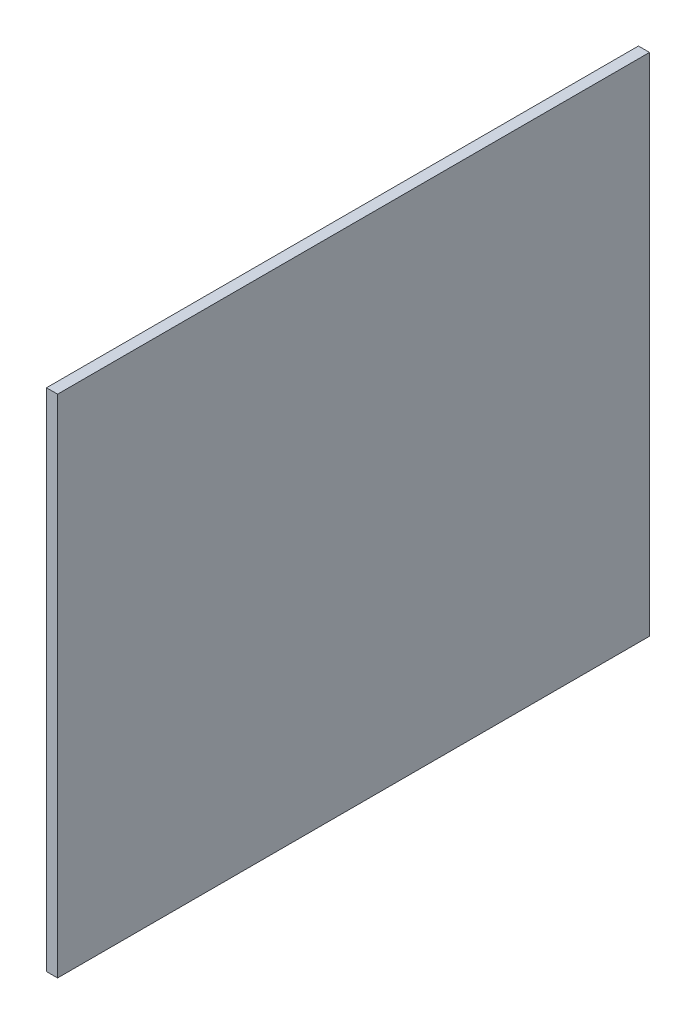
ISO-10303-21;
HEADER;
FILE_DESCRIPTION(('STEP AP214'),'2;1');
FILE_NAME('part.step','',(''),(''),'','','');
FILE_SCHEMA(('AUTOMOTIVE_DESIGN { 1 0 10303 214 1 1 1 1 }'));
ENDSEC;
DATA;
#1=APPLICATION_CONTEXT('core data for automotive mechanical design processes');
#2=APPLICATION_PROTOCOL_DEFINITION('international standard','automotive_design',2000,#1);
#3=PRODUCT_CONTEXT('',#1,'mechanical');
#4=PRODUCT('Part','Part','',(#3));
#5=PRODUCT_RELATED_PRODUCT_CATEGORY('part','',(#4));
#6=PRODUCT_DEFINITION_FORMATION('','',#4);
#7=PRODUCT_DEFINITION_CONTEXT('part definition',#1,'design');
#8=PRODUCT_DEFINITION('design','',#6,#7);
#9=PRODUCT_DEFINITION_SHAPE('','',#8);
#10=(LENGTH_UNIT() NAMED_UNIT(*) SI_UNIT(.MILLI.,.METRE.));
#11=(NAMED_UNIT(*) PLANE_ANGLE_UNIT() SI_UNIT($,.RADIAN.));
#12=(NAMED_UNIT(*) SI_UNIT($,.STERADIAN.) SOLID_ANGLE_UNIT());
#13=UNCERTAINTY_MEASURE_WITH_UNIT(LENGTH_MEASURE(1.E-05),#10,'distance_accuracy_value','');
#14=(GEOMETRIC_REPRESENTATION_CONTEXT(3) GLOBAL_UNCERTAINTY_ASSIGNED_CONTEXT((#13)) GLOBAL_UNIT_ASSIGNED_CONTEXT((#10,
#11,#12)) REPRESENTATION_CONTEXT('',''));
#15=CARTESIAN_POINT('',(0.,0.,0.));
#16=DIRECTION('',(0.,0.,1.));
#17=DIRECTION('',(1.,0.,0.));
#18=AXIS2_PLACEMENT_3D('',#15,#16,#17);
#19=CARTESIAN_POINT('',(18.,410.,-480.));
#20=DIRECTION('',(0.,0.,1.));
#21=DIRECTION('',(1.,0.,0.));
#22=AXIS2_PLACEMENT_3D('',#19,#20,#21);
#23=PLANE('',#22);
#24=DIRECTION('',(0.,1.,0.));
#25=VECTOR('',#24,1.);
#26=CARTESIAN_POINT('',(0.,410.,-480.));
#27=LINE('',#26,#25);
#28=CARTESIAN_POINT('',(0.,-410.,-480.));
#29=VERTEX_POINT('',#28);
#30=CARTESIAN_POINT('',(0.,410.,-480.));
#31=VERTEX_POINT('',#30);
#32=EDGE_CURVE('E107',#29,#31,#27,.T.);
#33=ORIENTED_EDGE('',*,*,#32,.T.);
#34=DIRECTION('',(-1.,0.,0.));
#35=VECTOR('',#34,1.);
#36=CARTESIAN_POINT('',(18.,410.,-480.));
#37=LINE('',#36,#35);
#38=CARTESIAN_POINT('',(18.,410.,-480.));
#39=VERTEX_POINT('',#38);
#40=EDGE_CURVE('E11',#39,#31,#37,.T.);
#41=ORIENTED_EDGE('',*,*,#40,.F.);
#42=DIRECTION('',(0.,1.,0.));
#43=VECTOR('',#42,1.);
#44=CARTESIAN_POINT('',(18.,410.,-480.));
#45=LINE('',#44,#43);
#46=CARTESIAN_POINT('',(18.,-410.,-480.));
#47=VERTEX_POINT('',#46);
#48=EDGE_CURVE('E91',#47,#39,#45,.T.);
#49=ORIENTED_EDGE('',*,*,#48,.F.);
#50=DIRECTION('',(-1.,0.,0.));
#51=VECTOR('',#50,1.);
#52=CARTESIAN_POINT('',(18.,-410.,-480.));
#53=LINE('',#52,#51);
#54=EDGE_CURVE('E103',#47,#29,#53,.T.);
#55=ORIENTED_EDGE('',*,*,#54,.T.);
#56=EDGE_LOOP('',(#33,#41,#49,#55));
#57=FACE_BOUND('',#56,.T.);
#58=ADVANCED_FACE('F39',(#57),#23,.F.);
#59=CARTESIAN_POINT('',(18.,410.,480.));
#60=DIRECTION('',(0.,-1.,0.));
#61=DIRECTION('',(0.,0.,-1.));
#62=AXIS2_PLACEMENT_3D('',#59,#60,#61);
#63=PLANE('',#62);
#64=DIRECTION('',(0.,0.,1.));
#65=VECTOR('',#64,1.);
#66=CARTESIAN_POINT('',(0.,410.,480.));
#67=LINE('',#66,#65);
#68=CARTESIAN_POINT('',(0.,410.,480.));
#69=VERTEX_POINT('',#68);
#70=EDGE_CURVE('E96',#31,#69,#67,.T.);
#71=ORIENTED_EDGE('',*,*,#70,.T.);
#72=DIRECTION('',(-1.,0.,0.));
#73=VECTOR('',#72,1.);
#74=CARTESIAN_POINT('',(18.,410.,480.));
#75=LINE('',#74,#73);
#76=CARTESIAN_POINT('',(18.,410.,480.));
#77=VERTEX_POINT('',#76);
#78=EDGE_CURVE('E48',#77,#69,#75,.T.);
#79=ORIENTED_EDGE('',*,*,#78,.F.);
#80=DIRECTION('',(0.,0.,1.));
#81=VECTOR('',#80,1.);
#82=CARTESIAN_POINT('',(18.,410.,480.));
#83=LINE('',#82,#81);
#84=EDGE_CURVE('E86',#39,#77,#83,.T.);
#85=ORIENTED_EDGE('',*,*,#84,.F.);
#86=ORIENTED_EDGE('',*,*,#40,.T.);
#87=EDGE_LOOP('',(#71,#79,#85,#86));
#88=FACE_BOUND('',#87,.T.);
#89=ADVANCED_FACE('F95',(#88),#63,.F.);
#90=CARTESIAN_POINT('',(18.,410.,480.));
#91=DIRECTION('',(0.,0.,-1.));
#92=DIRECTION('',(-1.,0.,0.));
#93=AXIS2_PLACEMENT_3D('',#90,#91,#92);
#94=PLANE('',#93);
#95=DIRECTION('',(0.,-1.,0.));
#96=VECTOR('',#95,1.);
#97=CARTESIAN_POINT('',(0.,410.,480.));
#98=LINE('',#97,#96);
#99=CARTESIAN_POINT('',(0.,-410.,480.));
#100=VERTEX_POINT('',#99);
#101=EDGE_CURVE('E73',#69,#100,#98,.T.);
#102=ORIENTED_EDGE('',*,*,#101,.T.);
#103=DIRECTION('',(-1.,0.,0.));
#104=VECTOR('',#103,1.);
#105=CARTESIAN_POINT('',(18.,-410.,480.));
#106=LINE('',#105,#104);
#107=CARTESIAN_POINT('',(18.,-410.,480.));
#108=VERTEX_POINT('',#107);
#109=EDGE_CURVE('E98',#108,#100,#106,.T.);
#110=ORIENTED_EDGE('',*,*,#109,.F.);
#111=DIRECTION('',(0.,-1.,0.));
#112=VECTOR('',#111,1.);
#113=CARTESIAN_POINT('',(18.,410.,480.));
#114=LINE('',#113,#112);
#115=EDGE_CURVE('E89',#77,#108,#114,.T.);
#116=ORIENTED_EDGE('',*,*,#115,.F.);
#117=ORIENTED_EDGE('',*,*,#78,.T.);
#118=EDGE_LOOP('',(#102,#110,#116,#117));
#119=FACE_BOUND('',#118,.T.);
#120=ADVANCED_FACE('F99',(#119),#94,.F.);
#121=CARTESIAN_POINT('',(18.,-410.,480.));
#122=DIRECTION('',(0.,1.,0.));
#123=DIRECTION('',(0.,0.,1.));
#124=AXIS2_PLACEMENT_3D('',#121,#122,#123);
#125=PLANE('',#124);
#126=DIRECTION('',(0.,0.,-1.));
#127=VECTOR('',#126,1.);
#128=CARTESIAN_POINT('',(0.,-410.,480.));
#129=LINE('',#128,#127);
#130=EDGE_CURVE('E79',#100,#29,#129,.T.);
#131=ORIENTED_EDGE('',*,*,#130,.T.);
#132=ORIENTED_EDGE('',*,*,#54,.F.);
#133=DIRECTION('',(0.,0.,-1.));
#134=VECTOR('',#133,1.);
#135=CARTESIAN_POINT('',(18.,-410.,480.));
#136=LINE('',#135,#134);
#137=EDGE_CURVE('E56',#108,#47,#136,.T.);
#138=ORIENTED_EDGE('',*,*,#137,.F.);
#139=ORIENTED_EDGE('',*,*,#109,.T.);
#140=EDGE_LOOP('',(#131,#132,#138,#139));
#141=FACE_BOUND('',#140,.T.);
#142=ADVANCED_FACE('F120',(#141),#125,.F.);
#143=CARTESIAN_POINT('',(18.,0.,0.));
#144=DIRECTION('',(1.,0.,0.));
#145=DIRECTION('',(0.,0.,-1.));
#146=AXIS2_PLACEMENT_3D('',#143,#144,#145);
#147=PLANE('',#146);
#148=ORIENTED_EDGE('',*,*,#48,.T.);
#149=ORIENTED_EDGE('',*,*,#84,.T.);
#150=ORIENTED_EDGE('',*,*,#115,.T.);
#151=ORIENTED_EDGE('',*,*,#137,.T.);
#152=EDGE_LOOP('',(#148,#149,#150,#151));
#153=FACE_BOUND('',#152,.T.);
#154=ADVANCED_FACE('F87',(#153),#147,.T.);
#155=CARTESIAN_POINT('',(0.,0.,0.));
#156=DIRECTION('',(1.,0.,0.));
#157=DIRECTION('',(0.,0.,-1.));
#158=AXIS2_PLACEMENT_3D('',#155,#156,#157);
#159=PLANE('',#158);
#160=ORIENTED_EDGE('',*,*,#32,.F.);
#161=ORIENTED_EDGE('',*,*,#130,.F.);
#162=ORIENTED_EDGE('',*,*,#101,.F.);
#163=ORIENTED_EDGE('',*,*,#70,.F.);
#164=EDGE_LOOP('',(#160,#161,#162,#163));
#165=FACE_BOUND('',#164,.T.);
#166=ADVANCED_FACE('F123',(#165),#159,.F.);
#167=CLOSED_SHELL('',(#58,#89,#120,#142,#154,#166));
#168=MANIFOLD_SOLID_BREP('B2',#167);
#169=ADVANCED_BREP_SHAPE_REPRESENTATION('',(#18,#168),#14);
#170=SHAPE_DEFINITION_REPRESENTATION(#9,#169);
ENDSEC;
END-ISO-10303-21;
